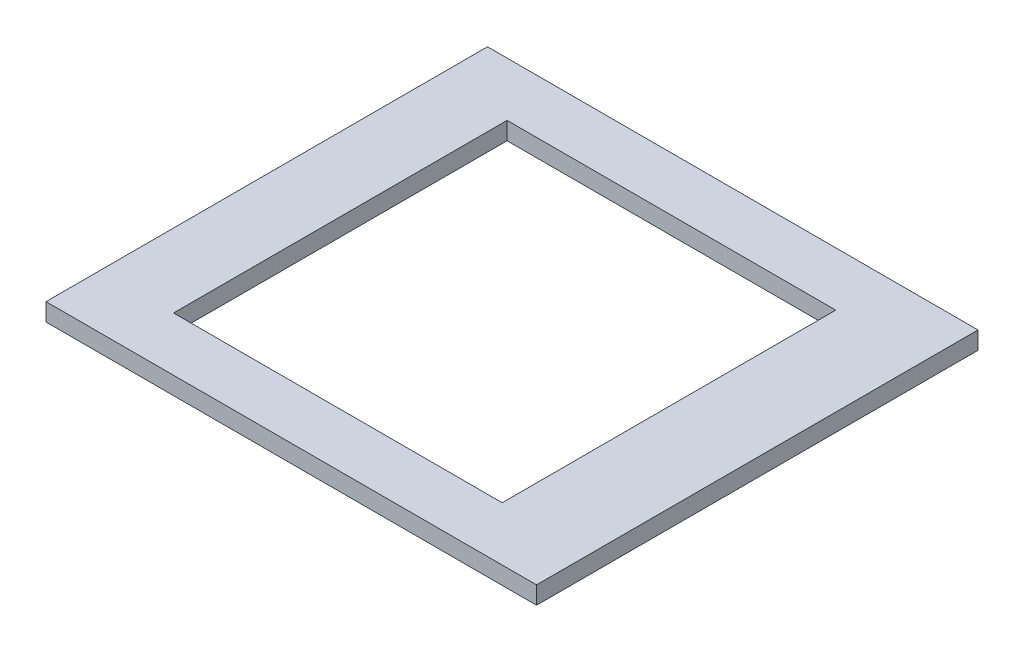
ISO-10303-21;
HEADER;
FILE_DESCRIPTION(('STEP AP214'),'2;1');
FILE_NAME('part.step','',(''),(''),'','','');
FILE_SCHEMA(('AUTOMOTIVE_DESIGN { 1 0 10303 214 1 1 1 1 }'));
ENDSEC;
DATA;
#1=APPLICATION_CONTEXT('core data for automotive mechanical design processes');
#2=APPLICATION_PROTOCOL_DEFINITION('international standard','automotive_design',2000,#1);
#3=PRODUCT_CONTEXT('',#1,'mechanical');
#4=PRODUCT('Part','Part','',(#3));
#5=PRODUCT_RELATED_PRODUCT_CATEGORY('part','',(#4));
#6=PRODUCT_DEFINITION_FORMATION('','',#4);
#7=PRODUCT_DEFINITION_CONTEXT('part definition',#1,'design');
#8=PRODUCT_DEFINITION('design','',#6,#7);
#9=PRODUCT_DEFINITION_SHAPE('','',#8);
#10=(LENGTH_UNIT() NAMED_UNIT(*) SI_UNIT(.MILLI.,.METRE.));
#11=(NAMED_UNIT(*) PLANE_ANGLE_UNIT() SI_UNIT($,.RADIAN.));
#12=(NAMED_UNIT(*) SI_UNIT($,.STERADIAN.) SOLID_ANGLE_UNIT());
#13=UNCERTAINTY_MEASURE_WITH_UNIT(LENGTH_MEASURE(1.E-05),#10,'distance_accuracy_value','');
#14=(GEOMETRIC_REPRESENTATION_CONTEXT(3) GLOBAL_UNCERTAINTY_ASSIGNED_CONTEXT((#13)) GLOBAL_UNIT_ASSIGNED_CONTEXT((#10,
#11,#12)) REPRESENTATION_CONTEXT('',''));
#15=CARTESIAN_POINT('',(0.,0.,0.));
#16=DIRECTION('',(0.,0.,1.));
#17=DIRECTION('',(1.,0.,0.));
#18=AXIS2_PLACEMENT_3D('',#15,#16,#17);
#19=CARTESIAN_POINT('',(0.,18.,0.));
#20=DIRECTION('',(0.,-1.,0.));
#21=DIRECTION('',(0.,0.,-1.));
#22=AXIS2_PLACEMENT_3D('',#19,#20,#21);
#23=PLANE('',#22);
#24=DIRECTION('',(0.,0.,1.));
#25=VECTOR('',#24,1.);
#26=CARTESIAN_POINT('',(0.,18.,0.));
#27=LINE('',#26,#25);
#28=CARTESIAN_POINT('',(0.,18.,-450.));
#29=VERTEX_POINT('',#28);
#30=CARTESIAN_POINT('',(0.,18.,0.));
#31=VERTEX_POINT('',#30);
#32=EDGE_CURVE('E134',#29,#31,#27,.T.);
#33=ORIENTED_EDGE('',*,*,#32,.T.);
#34=DIRECTION('',(1.,0.,0.));
#35=VECTOR('',#34,1.);
#36=CARTESIAN_POINT('',(0.,18.,0.));
#37=LINE('',#36,#35);
#38=CARTESIAN_POINT('',(500.,18.,0.));
#39=VERTEX_POINT('',#38);
#40=EDGE_CURVE('E137',#31,#39,#37,.T.);
#41=ORIENTED_EDGE('',*,*,#40,.T.);
#42=DIRECTION('',(0.,0.,-1.));
#43=VECTOR('',#42,1.);
#44=CARTESIAN_POINT('',(500.,18.,0.));
#45=LINE('',#44,#43);
#46=CARTESIAN_POINT('',(500.,18.,-450.));
#47=VERTEX_POINT('',#46);
#48=EDGE_CURVE('E140',#39,#47,#45,.T.);
#49=ORIENTED_EDGE('',*,*,#48,.T.);
#50=DIRECTION('',(-1.,0.,0.));
#51=VECTOR('',#50,1.);
#52=CARTESIAN_POINT('',(0.,18.,-450.));
#53=LINE('',#52,#51);
#54=EDGE_CURVE('E142',#47,#29,#53,.T.);
#55=ORIENTED_EDGE('',*,*,#54,.T.);
#56=EDGE_LOOP('',(#33,#41,#49,#55));
#57=FACE_BOUND('',#56,.T.);
#58=DIRECTION('',(0.,0.,1.));
#59=VECTOR('',#58,1.);
#60=CARTESIAN_POINT('',(75.,18.,-395.));
#61=LINE('',#60,#59);
#62=CARTESIAN_POINT('',(75.,18.,-395.));
#63=VERTEX_POINT('',#62);
#64=CARTESIAN_POINT('',(75.0000000000001,18.,-55.));
#65=VERTEX_POINT('',#64);
#66=EDGE_CURVE('E98',#63,#65,#61,.T.);
#67=ORIENTED_EDGE('',*,*,#66,.F.);
#68=DIRECTION('',(-1.,0.,0.));
#69=VECTOR('',#68,1.);
#70=CARTESIAN_POINT('',(75.,18.,-395.));
#71=LINE('',#70,#69);
#72=CARTESIAN_POINT('',(410.,18.,-395.));
#73=VERTEX_POINT('',#72);
#74=EDGE_CURVE('E120',#73,#63,#71,.T.);
#75=ORIENTED_EDGE('',*,*,#74,.F.);
#76=DIRECTION('',(0.,0.,-1.));
#77=VECTOR('',#76,1.);
#78=CARTESIAN_POINT('',(410.,18.,-395.));
#79=LINE('',#78,#77);
#80=CARTESIAN_POINT('',(410.,18.,-55.));
#81=VERTEX_POINT('',#80);
#82=EDGE_CURVE('E118',#81,#73,#79,.T.);
#83=ORIENTED_EDGE('',*,*,#82,.F.);
#84=DIRECTION('',(1.,0.,0.));
#85=VECTOR('',#84,1.);
#86=CARTESIAN_POINT('',(75.0000000000001,18.,-55.));
#87=LINE('',#86,#85);
#88=EDGE_CURVE('E106',#65,#81,#87,.T.);
#89=ORIENTED_EDGE('',*,*,#88,.F.);
#90=EDGE_LOOP('',(#67,#75,#83,#89));
#91=FACE_BOUND('',#90,.T.);
#92=ADVANCED_FACE('F33',(#57,#91),#23,.F.);
#93=CARTESIAN_POINT('',(0.,0.,0.));
#94=DIRECTION('',(0.,-1.,0.));
#95=DIRECTION('',(0.,0.,-1.));
#96=AXIS2_PLACEMENT_3D('',#93,#94,#95);
#97=PLANE('',#96);
#98=DIRECTION('',(0.,0.,1.));
#99=VECTOR('',#98,1.);
#100=CARTESIAN_POINT('',(0.,0.,0.));
#101=LINE('',#100,#99);
#102=CARTESIAN_POINT('',(0.,0.,-450.));
#103=VERTEX_POINT('',#102);
#104=CARTESIAN_POINT('',(0.,0.,0.));
#105=VERTEX_POINT('',#104);
#106=EDGE_CURVE('E114',#103,#105,#101,.T.);
#107=ORIENTED_EDGE('',*,*,#106,.F.);
#108=DIRECTION('',(-1.,0.,0.));
#109=VECTOR('',#108,1.);
#110=CARTESIAN_POINT('',(0.,0.,-450.));
#111=LINE('',#110,#109);
#112=CARTESIAN_POINT('',(500.,0.,-450.));
#113=VERTEX_POINT('',#112);
#114=EDGE_CURVE('E138',#113,#103,#111,.T.);
#115=ORIENTED_EDGE('',*,*,#114,.F.);
#116=DIRECTION('',(0.,0.,-1.));
#117=VECTOR('',#116,1.);
#118=CARTESIAN_POINT('',(500.,0.,0.));
#119=LINE('',#118,#117);
#120=CARTESIAN_POINT('',(500.,0.,0.));
#121=VERTEX_POINT('',#120);
#122=EDGE_CURVE('E149',#121,#113,#119,.T.);
#123=ORIENTED_EDGE('',*,*,#122,.F.);
#124=DIRECTION('',(1.,0.,0.));
#125=VECTOR('',#124,1.);
#126=CARTESIAN_POINT('',(0.,0.,0.));
#127=LINE('',#126,#125);
#128=EDGE_CURVE('E147',#105,#121,#127,.T.);
#129=ORIENTED_EDGE('',*,*,#128,.F.);
#130=EDGE_LOOP('',(#107,#115,#123,#129));
#131=FACE_BOUND('',#130,.T.);
#132=DIRECTION('',(-1.,0.,0.));
#133=VECTOR('',#132,1.);
#134=CARTESIAN_POINT('',(75.,0.,-395.));
#135=LINE('',#134,#133);
#136=CARTESIAN_POINT('',(410.,0.,-395.));
#137=VERTEX_POINT('',#136);
#138=CARTESIAN_POINT('',(75.,0.,-395.));
#139=VERTEX_POINT('',#138);
#140=EDGE_CURVE('E107',#137,#139,#135,.T.);
#141=ORIENTED_EDGE('',*,*,#140,.T.);
#142=DIRECTION('',(0.,0.,1.));
#143=VECTOR('',#142,1.);
#144=CARTESIAN_POINT('',(75.,0.,-395.));
#145=LINE('',#144,#143);
#146=CARTESIAN_POINT('',(75.0000000000001,0.,-55.));
#147=VERTEX_POINT('',#146);
#148=EDGE_CURVE('E56',#139,#147,#145,.T.);
#149=ORIENTED_EDGE('',*,*,#148,.T.);
#150=DIRECTION('',(1.,0.,0.));
#151=VECTOR('',#150,1.);
#152=CARTESIAN_POINT('',(75.0000000000001,0.,-55.));
#153=LINE('',#152,#151);
#154=CARTESIAN_POINT('',(410.,0.,-55.));
#155=VERTEX_POINT('',#154);
#156=EDGE_CURVE('E113',#147,#155,#153,.T.);
#157=ORIENTED_EDGE('',*,*,#156,.T.);
#158=DIRECTION('',(0.,0.,-1.));
#159=VECTOR('',#158,1.);
#160=CARTESIAN_POINT('',(410.,0.,-395.));
#161=LINE('',#160,#159);
#162=EDGE_CURVE('E126',#155,#137,#161,.T.);
#163=ORIENTED_EDGE('',*,*,#162,.T.);
#164=EDGE_LOOP('',(#141,#149,#157,#163));
#165=FACE_BOUND('',#164,.T.);
#166=ADVANCED_FACE('F167',(#131,#165),#97,.T.);
#167=CARTESIAN_POINT('',(0.,18.,0.));
#168=DIRECTION('',(1.,0.,0.));
#169=DIRECTION('',(0.,0.,-1.));
#170=AXIS2_PLACEMENT_3D('',#167,#168,#169);
#171=PLANE('',#170);
#172=ORIENTED_EDGE('',*,*,#106,.T.);
#173=DIRECTION('',(0.,-1.,0.));
#174=VECTOR('',#173,1.);
#175=CARTESIAN_POINT('',(0.,18.,0.));
#176=LINE('',#175,#174);
#177=EDGE_CURVE('E11',#31,#105,#176,.T.);
#178=ORIENTED_EDGE('',*,*,#177,.F.);
#179=ORIENTED_EDGE('',*,*,#32,.F.);
#180=DIRECTION('',(0.,-1.,0.));
#181=VECTOR('',#180,1.);
#182=CARTESIAN_POINT('',(0.,18.,-450.));
#183=LINE('',#182,#181);
#184=EDGE_CURVE('E144',#29,#103,#183,.T.);
#185=ORIENTED_EDGE('',*,*,#184,.T.);
#186=EDGE_LOOP('',(#172,#178,#179,#185));
#187=FACE_BOUND('',#186,.T.);
#188=ADVANCED_FACE('F35',(#187),#171,.F.);
#189=CARTESIAN_POINT('',(0.,18.,0.));
#190=DIRECTION('',(0.,0.,-1.));
#191=DIRECTION('',(-1.,0.,0.));
#192=AXIS2_PLACEMENT_3D('',#189,#190,#191);
#193=PLANE('',#192);
#194=ORIENTED_EDGE('',*,*,#128,.T.);
#195=DIRECTION('',(0.,-1.,0.));
#196=VECTOR('',#195,1.);
#197=CARTESIAN_POINT('',(500.,18.,0.));
#198=LINE('',#197,#196);
#199=EDGE_CURVE('E41',#39,#121,#198,.T.);
#200=ORIENTED_EDGE('',*,*,#199,.F.);
#201=ORIENTED_EDGE('',*,*,#40,.F.);
#202=ORIENTED_EDGE('',*,*,#177,.T.);
#203=EDGE_LOOP('',(#194,#200,#201,#202));
#204=FACE_BOUND('',#203,.T.);
#205=ADVANCED_FACE('F177',(#204),#193,.F.);
#206=CARTESIAN_POINT('',(500.,18.,0.));
#207=DIRECTION('',(-1.,0.,0.));
#208=DIRECTION('',(0.,0.,1.));
#209=AXIS2_PLACEMENT_3D('',#206,#207,#208);
#210=PLANE('',#209);
#211=ORIENTED_EDGE('',*,*,#122,.T.);
#212=DIRECTION('',(0.,-1.,0.));
#213=VECTOR('',#212,1.);
#214=CARTESIAN_POINT('',(500.,18.,-450.));
#215=LINE('',#214,#213);
#216=EDGE_CURVE('E154',#47,#113,#215,.T.);
#217=ORIENTED_EDGE('',*,*,#216,.F.);
#218=ORIENTED_EDGE('',*,*,#48,.F.);
#219=ORIENTED_EDGE('',*,*,#199,.T.);
#220=EDGE_LOOP('',(#211,#217,#218,#219));
#221=FACE_BOUND('',#220,.T.);
#222=ADVANCED_FACE('F161',(#221),#210,.F.);
#223=CARTESIAN_POINT('',(0.,18.,-450.));
#224=DIRECTION('',(0.,0.,1.));
#225=DIRECTION('',(1.,0.,0.));
#226=AXIS2_PLACEMENT_3D('',#223,#224,#225);
#227=PLANE('',#226);
#228=ORIENTED_EDGE('',*,*,#114,.T.);
#229=ORIENTED_EDGE('',*,*,#184,.F.);
#230=ORIENTED_EDGE('',*,*,#54,.F.);
#231=ORIENTED_EDGE('',*,*,#216,.T.);
#232=EDGE_LOOP('',(#228,#229,#230,#231));
#233=FACE_BOUND('',#232,.T.);
#234=ADVANCED_FACE('F171',(#233),#227,.F.);
#235=CARTESIAN_POINT('',(75.,18.,-395.));
#236=DIRECTION('',(1.,0.,0.));
#237=DIRECTION('',(0.,0.,-1.));
#238=AXIS2_PLACEMENT_3D('',#235,#236,#237);
#239=PLANE('',#238);
#240=ORIENTED_EDGE('',*,*,#148,.F.);
#241=DIRECTION('',(0.,-1.,0.));
#242=VECTOR('',#241,1.);
#243=CARTESIAN_POINT('',(75.,18.,-395.));
#244=LINE('',#243,#242);
#245=EDGE_CURVE('E102',#63,#139,#244,.T.);
#246=ORIENTED_EDGE('',*,*,#245,.F.);
#247=ORIENTED_EDGE('',*,*,#66,.T.);
#248=DIRECTION('',(0.,-1.,0.));
#249=VECTOR('',#248,1.);
#250=CARTESIAN_POINT('',(75.0000000000001,18.,-55.));
#251=LINE('',#250,#249);
#252=EDGE_CURVE('E101',#65,#147,#251,.T.);
#253=ORIENTED_EDGE('',*,*,#252,.T.);
#254=EDGE_LOOP('',(#240,#246,#247,#253));
#255=FACE_BOUND('',#254,.T.);
#256=ADVANCED_FACE('F100',(#255),#239,.T.);
#257=CARTESIAN_POINT('',(75.0000000000001,18.,-55.));
#258=DIRECTION('',(0.,0.,-1.));
#259=DIRECTION('',(-1.,0.,0.));
#260=AXIS2_PLACEMENT_3D('',#257,#258,#259);
#261=PLANE('',#260);
#262=ORIENTED_EDGE('',*,*,#156,.F.);
#263=ORIENTED_EDGE('',*,*,#252,.F.);
#264=ORIENTED_EDGE('',*,*,#88,.T.);
#265=DIRECTION('',(0.,-1.,0.));
#266=VECTOR('',#265,1.);
#267=CARTESIAN_POINT('',(410.,18.,-55.));
#268=LINE('',#267,#266);
#269=EDGE_CURVE('E115',#81,#155,#268,.T.);
#270=ORIENTED_EDGE('',*,*,#269,.T.);
#271=EDGE_LOOP('',(#262,#263,#264,#270));
#272=FACE_BOUND('',#271,.T.);
#273=ADVANCED_FACE('F110',(#272),#261,.T.);
#274=CARTESIAN_POINT('',(410.,18.,-395.));
#275=DIRECTION('',(-1.,0.,0.));
#276=DIRECTION('',(0.,0.,1.));
#277=AXIS2_PLACEMENT_3D('',#274,#275,#276);
#278=PLANE('',#277);
#279=ORIENTED_EDGE('',*,*,#162,.F.);
#280=ORIENTED_EDGE('',*,*,#269,.F.);
#281=ORIENTED_EDGE('',*,*,#82,.T.);
#282=DIRECTION('',(0.,-1.,0.));
#283=VECTOR('',#282,1.);
#284=CARTESIAN_POINT('',(410.,18.,-395.));
#285=LINE('',#284,#283);
#286=EDGE_CURVE('E48',#73,#137,#285,.T.);
#287=ORIENTED_EDGE('',*,*,#286,.T.);
#288=EDGE_LOOP('',(#279,#280,#281,#287));
#289=FACE_BOUND('',#288,.T.);
#290=ADVANCED_FACE('F200',(#289),#278,.T.);
#291=CARTESIAN_POINT('',(75.,18.,-395.));
#292=DIRECTION('',(0.,0.,1.));
#293=DIRECTION('',(1.,0.,0.));
#294=AXIS2_PLACEMENT_3D('',#291,#292,#293);
#295=PLANE('',#294);
#296=ORIENTED_EDGE('',*,*,#140,.F.);
#297=ORIENTED_EDGE('',*,*,#286,.F.);
#298=ORIENTED_EDGE('',*,*,#74,.T.);
#299=ORIENTED_EDGE('',*,*,#245,.T.);
#300=EDGE_LOOP('',(#296,#297,#298,#299));
#301=FACE_BOUND('',#300,.T.);
#302=ADVANCED_FACE('F204',(#301),#295,.T.);
#303=CLOSED_SHELL('',(#92,#166,#188,#205,#222,#234,#256,#273,#290,#302));
#304=MANIFOLD_SOLID_BREP('B2',#303);
#305=ADVANCED_BREP_SHAPE_REPRESENTATION('',(#18,#304),#14);
#306=SHAPE_DEFINITION_REPRESENTATION(#9,#305);
ENDSEC;
END-ISO-10303-21;
